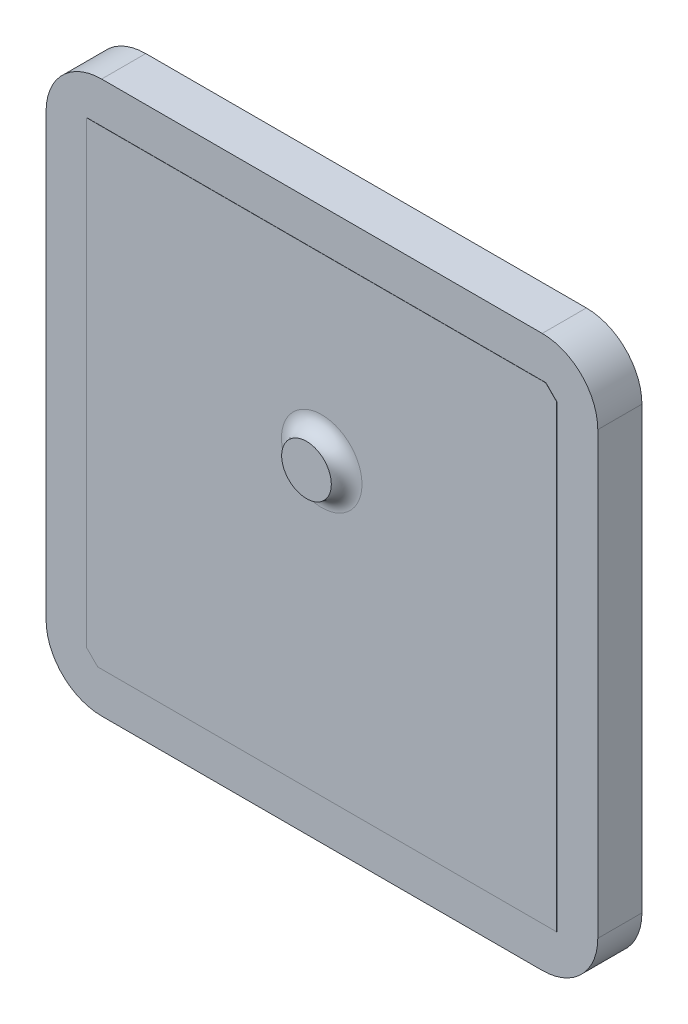
ISO-10303-21;
HEADER;
FILE_DESCRIPTION(('STEP AP214'),'2;1');
FILE_NAME('part.step','',(''),(''),'','','');
FILE_SCHEMA(('AUTOMOTIVE_DESIGN { 1 0 10303 214 1 1 1 1 }'));
ENDSEC;
DATA;
#1=APPLICATION_CONTEXT('core data for automotive mechanical design processes');
#2=APPLICATION_PROTOCOL_DEFINITION('international standard','automotive_design',2000,#1);
#3=PRODUCT_CONTEXT('',#1,'mechanical');
#4=PRODUCT('Part','Part','',(#3));
#5=PRODUCT_RELATED_PRODUCT_CATEGORY('part','',(#4));
#6=PRODUCT_DEFINITION_FORMATION('','',#4);
#7=PRODUCT_DEFINITION_CONTEXT('part definition',#1,'design');
#8=PRODUCT_DEFINITION('design','',#6,#7);
#9=PRODUCT_DEFINITION_SHAPE('','',#8);
#10=(LENGTH_UNIT() NAMED_UNIT(*) SI_UNIT(.MILLI.,.METRE.));
#11=(NAMED_UNIT(*) PLANE_ANGLE_UNIT() SI_UNIT($,.RADIAN.));
#12=(NAMED_UNIT(*) SI_UNIT($,.STERADIAN.) SOLID_ANGLE_UNIT());
#13=UNCERTAINTY_MEASURE_WITH_UNIT(LENGTH_MEASURE(1.E-05),#10,'distance_accuracy_value','');
#14=(GEOMETRIC_REPRESENTATION_CONTEXT(3) GLOBAL_UNCERTAINTY_ASSIGNED_CONTEXT((#13)) GLOBAL_UNIT_ASSIGNED_CONTEXT((#10,
#11,#12)) REPRESENTATION_CONTEXT('',''));
#15=CARTESIAN_POINT('',(0.,0.,0.));
#16=DIRECTION('',(0.,0.,1.));
#17=DIRECTION('',(1.,0.,0.));
#18=AXIS2_PLACEMENT_3D('',#15,#16,#17);
#19=CARTESIAN_POINT('',(-12.5,12.5,2.));
#20=DIRECTION('',(1.,0.,0.));
#21=DIRECTION('',(0.,1.,0.));
#22=AXIS2_PLACEMENT_3D('',#19,#20,#21);
#23=PLANE('',#22);
#24=DIRECTION('',(0.,-1.,0.));
#25=VECTOR('',#24,1.);
#26=CARTESIAN_POINT('',(-12.5,12.5,2.));
#27=LINE('',#26,#25);
#28=CARTESIAN_POINT('',(-12.5,9.98277308041276,2.));
#29=VERTEX_POINT('',#28);
#30=CARTESIAN_POINT('',(-12.5,-9.98277308041276,2.));
#31=VERTEX_POINT('',#30);
#32=EDGE_CURVE('E161',#29,#31,#27,.T.);
#33=ORIENTED_EDGE('',*,*,#32,.F.);
#34=DIRECTION('',(0.,0.,1.));
#35=VECTOR('',#34,1.);
#36=CARTESIAN_POINT('',(-12.5,9.98277308041276,0.));
#37=LINE('',#36,#35);
#38=CARTESIAN_POINT('',(-12.5,9.98277308041276,0.));
#39=VERTEX_POINT('',#38);
#40=EDGE_CURVE('E252',#39,#29,#37,.T.);
#41=ORIENTED_EDGE('',*,*,#40,.F.);
#42=DIRECTION('',(0.,-1.,0.));
#43=VECTOR('',#42,1.);
#44=CARTESIAN_POINT('',(-12.5,12.5,0.));
#45=LINE('',#44,#43);
#46=CARTESIAN_POINT('',(-12.5,-9.98277308041276,0.));
#47=VERTEX_POINT('',#46);
#48=EDGE_CURVE('E163',#39,#47,#45,.T.);
#49=ORIENTED_EDGE('',*,*,#48,.T.);
#50=DIRECTION('',(0.,0.,1.));
#51=VECTOR('',#50,1.);
#52=CARTESIAN_POINT('',(-12.5,-9.98277308041276,0.));
#53=LINE('',#52,#51);
#54=EDGE_CURVE('E251',#47,#31,#53,.T.);
#55=ORIENTED_EDGE('',*,*,#54,.T.);
#56=EDGE_LOOP('',(#33,#41,#49,#55));
#57=FACE_BOUND('',#56,.T.);
#58=ADVANCED_FACE('F35',(#57),#23,.F.);
#59=CARTESIAN_POINT('',(-12.5,-12.5,2.));
#60=DIRECTION('',(0.,1.,0.));
#61=DIRECTION('',(0.,0.,1.));
#62=AXIS2_PLACEMENT_3D('',#59,#60,#61);
#63=PLANE('',#62);
#64=DIRECTION('',(0.,0.,1.));
#65=VECTOR('',#64,1.);
#66=CARTESIAN_POINT('',(9.98277308041275,-12.5,0.));
#67=LINE('',#66,#65);
#68=CARTESIAN_POINT('',(9.98277308041275,-12.5,0.));
#69=VERTEX_POINT('',#68);
#70=CARTESIAN_POINT('',(9.98277308041275,-12.5,2.));
#71=VERTEX_POINT('',#70);
#72=EDGE_CURVE('E50',#69,#71,#67,.T.);
#73=ORIENTED_EDGE('',*,*,#72,.T.);
#74=DIRECTION('',(1.,0.,0.));
#75=VECTOR('',#74,1.);
#76=CARTESIAN_POINT('',(-12.5,-12.5,2.));
#77=LINE('',#76,#75);
#78=CARTESIAN_POINT('',(-9.98277308041275,-12.5,2.));
#79=VERTEX_POINT('',#78);
#80=EDGE_CURVE('E241',#79,#71,#77,.T.);
#81=ORIENTED_EDGE('',*,*,#80,.F.);
#82=DIRECTION('',(0.,0.,1.));
#83=VECTOR('',#82,1.);
#84=CARTESIAN_POINT('',(-9.98277308041275,-12.5,0.));
#85=LINE('',#84,#83);
#86=CARTESIAN_POINT('',(-9.98277308041275,-12.5,0.));
#87=VERTEX_POINT('',#86);
#88=EDGE_CURVE('E205',#87,#79,#85,.T.);
#89=ORIENTED_EDGE('',*,*,#88,.F.);
#90=DIRECTION('',(1.,0.,0.));
#91=VECTOR('',#90,1.);
#92=CARTESIAN_POINT('',(-12.5,-12.5,0.));
#93=LINE('',#92,#91);
#94=EDGE_CURVE('E158',#87,#69,#93,.T.);
#95=ORIENTED_EDGE('',*,*,#94,.T.);
#96=EDGE_LOOP('',(#73,#81,#89,#95));
#97=FACE_BOUND('',#96,.T.);
#98=ADVANCED_FACE('F271',(#97),#63,.F.);
#99=CARTESIAN_POINT('',(12.5,12.5,2.));
#100=DIRECTION('',(-1.,0.,0.));
#101=DIRECTION('',(0.,-1.,0.));
#102=AXIS2_PLACEMENT_3D('',#99,#100,#101);
#103=PLANE('',#102);
#104=DIRECTION('',(0.,0.,1.));
#105=VECTOR('',#104,1.);
#106=CARTESIAN_POINT('',(12.5,9.98277308041276,0.));
#107=LINE('',#106,#105);
#108=CARTESIAN_POINT('',(12.5,9.98277308041276,0.));
#109=VERTEX_POINT('',#108);
#110=CARTESIAN_POINT('',(12.5,9.98277308041276,2.));
#111=VERTEX_POINT('',#110);
#112=EDGE_CURVE('E58',#109,#111,#107,.T.);
#113=ORIENTED_EDGE('',*,*,#112,.T.);
#114=DIRECTION('',(0.,1.,0.));
#115=VECTOR('',#114,1.);
#116=CARTESIAN_POINT('',(12.5,12.5,2.));
#117=LINE('',#116,#115);
#118=CARTESIAN_POINT('',(12.5,-9.98277308041275,2.));
#119=VERTEX_POINT('',#118);
#120=EDGE_CURVE('E150',#119,#111,#117,.T.);
#121=ORIENTED_EDGE('',*,*,#120,.F.);
#122=DIRECTION('',(0.,0.,1.));
#123=VECTOR('',#122,1.);
#124=CARTESIAN_POINT('',(12.5,-9.98277308041275,0.));
#125=LINE('',#124,#123);
#126=CARTESIAN_POINT('',(12.5,-9.98277308041275,0.));
#127=VERTEX_POINT('',#126);
#128=EDGE_CURVE('E136',#127,#119,#125,.T.);
#129=ORIENTED_EDGE('',*,*,#128,.F.);
#130=DIRECTION('',(0.,1.,0.));
#131=VECTOR('',#130,1.);
#132=CARTESIAN_POINT('',(12.5,12.5,0.));
#133=LINE('',#132,#131);
#134=EDGE_CURVE('E148',#127,#109,#133,.T.);
#135=ORIENTED_EDGE('',*,*,#134,.T.);
#136=EDGE_LOOP('',(#113,#121,#129,#135));
#137=FACE_BOUND('',#136,.T.);
#138=ADVANCED_FACE('F147',(#137),#103,.F.);
#139=CARTESIAN_POINT('',(-12.5,12.5,2.));
#140=DIRECTION('',(0.,-1.,0.));
#141=DIRECTION('',(0.,0.,-1.));
#142=AXIS2_PLACEMENT_3D('',#139,#140,#141);
#143=PLANE('',#142);
#144=DIRECTION('',(0.,0.,1.));
#145=VECTOR('',#144,1.);
#146=CARTESIAN_POINT('',(-9.98277308041276,12.5,0.));
#147=LINE('',#146,#145);
#148=CARTESIAN_POINT('',(-9.98277308041276,12.5,0.));
#149=VERTEX_POINT('',#148);
#150=CARTESIAN_POINT('',(-9.98277308041276,12.5,2.));
#151=VERTEX_POINT('',#150);
#152=EDGE_CURVE('E262',#149,#151,#147,.T.);
#153=ORIENTED_EDGE('',*,*,#152,.T.);
#154=DIRECTION('',(-1.,0.,0.));
#155=VECTOR('',#154,1.);
#156=CARTESIAN_POINT('',(-12.5,12.5,2.));
#157=LINE('',#156,#155);
#158=CARTESIAN_POINT('',(9.98277308041275,12.5,2.));
#159=VERTEX_POINT('',#158);
#160=EDGE_CURVE('E171',#159,#151,#157,.T.);
#161=ORIENTED_EDGE('',*,*,#160,.F.);
#162=DIRECTION('',(0.,0.,1.));
#163=VECTOR('',#162,1.);
#164=CARTESIAN_POINT('',(9.98277308041275,12.5,0.));
#165=LINE('',#164,#163);
#166=CARTESIAN_POINT('',(9.98277308041275,12.5,0.));
#167=VERTEX_POINT('',#166);
#168=EDGE_CURVE('E278',#167,#159,#165,.T.);
#169=ORIENTED_EDGE('',*,*,#168,.F.);
#170=DIRECTION('',(-1.,0.,0.));
#171=VECTOR('',#170,1.);
#172=CARTESIAN_POINT('',(-12.5,12.5,0.));
#173=LINE('',#172,#171);
#174=EDGE_CURVE('E157',#167,#149,#173,.T.);
#175=ORIENTED_EDGE('',*,*,#174,.T.);
#176=EDGE_LOOP('',(#153,#161,#169,#175));
#177=FACE_BOUND('',#176,.T.);
#178=ADVANCED_FACE('F288',(#177),#143,.F.);
#179=CARTESIAN_POINT('',(0.,0.,2.));
#180=DIRECTION('',(0.,0.,1.));
#181=DIRECTION('',(1.,0.,0.));
#182=AXIS2_PLACEMENT_3D('',#179,#180,#181);
#183=PLANE('',#182);
#184=CARTESIAN_POINT('',(-9.98277308041276,9.98277308041276,2.));
#185=DIRECTION('',(0.,0.,-1.));
#186=DIRECTION('',(-1.,0.,0.));
#187=AXIS2_PLACEMENT_3D('',#184,#185,#186);
#188=CIRCLE('',#187,2.51722691958725);
#189=EDGE_CURVE('E282',#29,#151,#188,.T.);
#190=ORIENTED_EDGE('',*,*,#189,.F.);
#191=ORIENTED_EDGE('',*,*,#32,.T.);
#192=CARTESIAN_POINT('',(-9.98277308041275,-9.98277308041275,2.));
#193=DIRECTION('',(0.,0.,-1.));
#194=DIRECTION('',(-1.,0.,0.));
#195=AXIS2_PLACEMENT_3D('',#192,#193,#194);
#196=CIRCLE('',#195,2.51722691958725);
#197=EDGE_CURVE('E151',#79,#31,#196,.T.);
#198=ORIENTED_EDGE('',*,*,#197,.F.);
#199=ORIENTED_EDGE('',*,*,#80,.T.);
#200=CARTESIAN_POINT('',(9.98277308041276,-9.98277308041276,2.));
#201=DIRECTION('',(0.,0.,-1.));
#202=DIRECTION('',(1.,0.,0.));
#203=AXIS2_PLACEMENT_3D('',#200,#201,#202);
#204=CIRCLE('',#203,2.51722691958725);
#205=EDGE_CURVE('E142',#119,#71,#204,.T.);
#206=ORIENTED_EDGE('',*,*,#205,.F.);
#207=ORIENTED_EDGE('',*,*,#120,.T.);
#208=CARTESIAN_POINT('',(9.98277308041275,9.98277308041276,2.));
#209=DIRECTION('',(0.,0.,-1.));
#210=DIRECTION('',(-1.,0.,0.));
#211=AXIS2_PLACEMENT_3D('',#208,#209,#210);
#212=CIRCLE('',#211,2.51722691958725);
#213=EDGE_CURVE('E276',#159,#111,#212,.T.);
#214=ORIENTED_EDGE('',*,*,#213,.F.);
#215=ORIENTED_EDGE('',*,*,#160,.T.);
#216=EDGE_LOOP('',(#190,#191,#198,#199,#206,#207,#214,#215));
#217=FACE_BOUND('',#216,.T.);
#218=DIRECTION('',(1.,0.,0.));
#219=VECTOR('',#218,1.);
#220=CARTESIAN_POINT('',(-10.65,-10.65,2.));
#221=LINE('',#220,#219);
#222=CARTESIAN_POINT('',(-10.15,-10.65,2.));
#223=VERTEX_POINT('',#222);
#224=CARTESIAN_POINT('',(10.65,-10.65,2.));
#225=VERTEX_POINT('',#224);
#226=EDGE_CURVE('E194',#223,#225,#221,.T.);
#227=ORIENTED_EDGE('',*,*,#226,.F.);
#228=DIRECTION('',(0.707106781186543,-0.707106781186552,0.));
#229=VECTOR('',#228,1.);
#230=CARTESIAN_POINT('',(-10.15,-10.65,2.));
#231=LINE('',#230,#229);
#232=CARTESIAN_POINT('',(-10.65,-10.15,2.));
#233=VERTEX_POINT('',#232);
#234=EDGE_CURVE('E43',#223,#233,#231,.F.);
#235=ORIENTED_EDGE('',*,*,#234,.T.);
#236=DIRECTION('',(0.,-1.,0.));
#237=VECTOR('',#236,1.);
#238=CARTESIAN_POINT('',(-10.65,10.65,2.));
#239=LINE('',#238,#237);
#240=CARTESIAN_POINT('',(-10.65,10.65,2.));
#241=VERTEX_POINT('',#240);
#242=EDGE_CURVE('E192',#241,#233,#239,.T.);
#243=ORIENTED_EDGE('',*,*,#242,.F.);
#244=DIRECTION('',(-1.,0.,0.));
#245=VECTOR('',#244,1.);
#246=CARTESIAN_POINT('',(-10.65,10.65,2.));
#247=LINE('',#246,#245);
#248=CARTESIAN_POINT('',(10.15,10.65,2.));
#249=VERTEX_POINT('',#248);
#250=EDGE_CURVE('E224',#249,#241,#247,.T.);
#251=ORIENTED_EDGE('',*,*,#250,.F.);
#252=DIRECTION('',(-0.707106781186548,0.707106781186548,0.));
#253=VECTOR('',#252,1.);
#254=CARTESIAN_POINT('',(10.15,10.65,2.));
#255=LINE('',#254,#253);
#256=CARTESIAN_POINT('',(10.65,10.15,2.));
#257=VERTEX_POINT('',#256);
#258=EDGE_CURVE('E185',#249,#257,#255,.F.);
#259=ORIENTED_EDGE('',*,*,#258,.T.);
#260=DIRECTION('',(0.,1.,0.));
#261=VECTOR('',#260,1.);
#262=CARTESIAN_POINT('',(10.65,10.65,2.));
#263=LINE('',#262,#261);
#264=EDGE_CURVE('E230',#225,#257,#263,.T.);
#265=ORIENTED_EDGE('',*,*,#264,.F.);
#266=EDGE_LOOP('',(#227,#235,#243,#251,#259,#265));
#267=FACE_BOUND('',#266,.T.);
#268=ADVANCED_FACE('F190',(#217,#267),#183,.T.);
#269=CARTESIAN_POINT('',(0.,0.,0.));
#270=DIRECTION('',(0.,0.,1.));
#271=DIRECTION('',(1.,0.,0.));
#272=AXIS2_PLACEMENT_3D('',#269,#270,#271);
#273=PLANE('',#272);
#274=CARTESIAN_POINT('',(0.,2.5,0.));
#275=DIRECTION('',(0.,0.,1.));
#276=DIRECTION('',(1.,0.,0.));
#277=AXIS2_PLACEMENT_3D('',#274,#275,#276);
#278=CIRCLE('',#277,0.4);
#279=CARTESIAN_POINT('',(0.4,2.5,0.));
#280=VERTEX_POINT('',#279);
#281=EDGE_CURVE('E11',#280,#280,#278,.F.);
#282=ORIENTED_EDGE('',*,*,#281,.F.);
#283=EDGE_LOOP('',(#282));
#284=FACE_BOUND('',#283,.T.);
#285=ORIENTED_EDGE('',*,*,#48,.F.);
#286=CARTESIAN_POINT('',(-9.98277308041276,9.98277308041276,0.));
#287=DIRECTION('',(0.,0.,-1.));
#288=DIRECTION('',(-1.,0.,0.));
#289=AXIS2_PLACEMENT_3D('',#286,#287,#288);
#290=CIRCLE('',#289,2.51722691958725);
#291=EDGE_CURVE('E255',#39,#149,#290,.T.);
#292=ORIENTED_EDGE('',*,*,#291,.T.);
#293=ORIENTED_EDGE('',*,*,#174,.F.);
#294=CARTESIAN_POINT('',(9.98277308041275,9.98277308041276,0.));
#295=DIRECTION('',(0.,0.,-1.));
#296=DIRECTION('',(-1.,0.,0.));
#297=AXIS2_PLACEMENT_3D('',#294,#295,#296);
#298=CIRCLE('',#297,2.51722691958725);
#299=EDGE_CURVE('E156',#167,#109,#298,.T.);
#300=ORIENTED_EDGE('',*,*,#299,.T.);
#301=ORIENTED_EDGE('',*,*,#134,.F.);
#302=CARTESIAN_POINT('',(9.98277308041276,-9.98277308041276,0.));
#303=DIRECTION('',(0.,0.,-1.));
#304=DIRECTION('',(1.,0.,0.));
#305=AXIS2_PLACEMENT_3D('',#302,#303,#304);
#306=CIRCLE('',#305,2.51722691958725);
#307=EDGE_CURVE('E133',#127,#69,#306,.T.);
#308=ORIENTED_EDGE('',*,*,#307,.T.);
#309=ORIENTED_EDGE('',*,*,#94,.F.);
#310=CARTESIAN_POINT('',(-9.98277308041275,-9.98277308041275,0.));
#311=DIRECTION('',(0.,0.,-1.));
#312=DIRECTION('',(-1.,0.,0.));
#313=AXIS2_PLACEMENT_3D('',#310,#311,#312);
#314=CIRCLE('',#313,2.51722691958725);
#315=EDGE_CURVE('E256',#87,#47,#314,.T.);
#316=ORIENTED_EDGE('',*,*,#315,.T.);
#317=EDGE_LOOP('',(#285,#292,#293,#300,#301,#308,#309,#316));
#318=FACE_BOUND('',#317,.T.);
#319=ADVANCED_FACE('F154',(#284,#318),#273,.F.);
#320=CARTESIAN_POINT('',(-10.65,10.65,2.01));
#321=DIRECTION('',(1.,0.,0.));
#322=DIRECTION('',(0.,1.,0.));
#323=AXIS2_PLACEMENT_3D('',#320,#321,#322);
#324=PLANE('',#323);
#325=ORIENTED_EDGE('',*,*,#242,.T.);
#326=DIRECTION('',(0.,0.,1.));
#327=VECTOR('',#326,1.);
#328=CARTESIAN_POINT('',(-10.65,-10.15,2.01));
#329=LINE('',#328,#327);
#330=CARTESIAN_POINT('',(-10.65,-10.15,2.01));
#331=VERTEX_POINT('',#330);
#332=EDGE_CURVE('E183',#233,#331,#329,.T.);
#333=ORIENTED_EDGE('',*,*,#332,.T.);
#334=DIRECTION('',(0.,-1.,0.));
#335=VECTOR('',#334,1.);
#336=CARTESIAN_POINT('',(-10.65,10.65,2.01));
#337=LINE('',#336,#335);
#338=CARTESIAN_POINT('',(-10.65,10.65,2.01));
#339=VERTEX_POINT('',#338);
#340=EDGE_CURVE('E214',#339,#331,#337,.T.);
#341=ORIENTED_EDGE('',*,*,#340,.F.);
#342=DIRECTION('',(0.,0.,-1.));
#343=VECTOR('',#342,1.);
#344=CARTESIAN_POINT('',(-10.65,10.65,2.01));
#345=LINE('',#344,#343);
#346=EDGE_CURVE('E204',#339,#241,#345,.T.);
#347=ORIENTED_EDGE('',*,*,#346,.T.);
#348=EDGE_LOOP('',(#325,#333,#341,#347));
#349=FACE_BOUND('',#348,.T.);
#350=ADVANCED_FACE('F200',(#349),#324,.F.);
#351=CARTESIAN_POINT('',(-10.65,-10.65,2.01));
#352=DIRECTION('',(0.,1.,0.));
#353=DIRECTION('',(0.,0.,1.));
#354=AXIS2_PLACEMENT_3D('',#351,#352,#353);
#355=PLANE('',#354);
#356=DIRECTION('',(1.,0.,0.));
#357=VECTOR('',#356,1.);
#358=CARTESIAN_POINT('',(-10.65,-10.65,2.01));
#359=LINE('',#358,#357);
#360=CARTESIAN_POINT('',(-10.15,-10.65,2.01));
#361=VERTEX_POINT('',#360);
#362=CARTESIAN_POINT('',(10.65,-10.65,2.01));
#363=VERTEX_POINT('',#362);
#364=EDGE_CURVE('E212',#361,#363,#359,.T.);
#365=ORIENTED_EDGE('',*,*,#364,.F.);
#366=DIRECTION('',(0.,0.,-1.));
#367=VECTOR('',#366,1.);
#368=CARTESIAN_POINT('',(-10.15,-10.65,2.01));
#369=LINE('',#368,#367);
#370=EDGE_CURVE('E180',#361,#223,#369,.T.);
#371=ORIENTED_EDGE('',*,*,#370,.T.);
#372=ORIENTED_EDGE('',*,*,#226,.T.);
#373=DIRECTION('',(0.,0.,-1.));
#374=VECTOR('',#373,1.);
#375=CARTESIAN_POINT('',(10.65,-10.65,2.01));
#376=LINE('',#375,#374);
#377=EDGE_CURVE('E218',#363,#225,#376,.T.);
#378=ORIENTED_EDGE('',*,*,#377,.F.);
#379=EDGE_LOOP('',(#365,#371,#372,#378));
#380=FACE_BOUND('',#379,.T.);
#381=ADVANCED_FACE('F216',(#380),#355,.F.);
#382=CARTESIAN_POINT('',(10.65,10.65,2.01));
#383=DIRECTION('',(-1.,0.,0.));
#384=DIRECTION('',(0.,-1.,0.));
#385=AXIS2_PLACEMENT_3D('',#382,#383,#384);
#386=PLANE('',#385);
#387=ORIENTED_EDGE('',*,*,#264,.T.);
#388=DIRECTION('',(0.,0.,1.));
#389=VECTOR('',#388,1.);
#390=CARTESIAN_POINT('',(10.65,10.15,2.01));
#391=LINE('',#390,#389);
#392=CARTESIAN_POINT('',(10.65,10.15,2.01));
#393=VERTEX_POINT('',#392);
#394=EDGE_CURVE('E174',#257,#393,#391,.T.);
#395=ORIENTED_EDGE('',*,*,#394,.T.);
#396=DIRECTION('',(0.,1.,0.));
#397=VECTOR('',#396,1.);
#398=CARTESIAN_POINT('',(10.65,10.65,2.01));
#399=LINE('',#398,#397);
#400=EDGE_CURVE('E220',#363,#393,#399,.T.);
#401=ORIENTED_EDGE('',*,*,#400,.F.);
#402=ORIENTED_EDGE('',*,*,#377,.T.);
#403=EDGE_LOOP('',(#387,#395,#401,#402));
#404=FACE_BOUND('',#403,.T.);
#405=ADVANCED_FACE('F327',(#404),#386,.F.);
#406=CARTESIAN_POINT('',(-10.65,10.65,2.01));
#407=DIRECTION('',(0.,-1.,0.));
#408=DIRECTION('',(0.,0.,-1.));
#409=AXIS2_PLACEMENT_3D('',#406,#407,#408);
#410=PLANE('',#409);
#411=DIRECTION('',(-1.,0.,0.));
#412=VECTOR('',#411,1.);
#413=CARTESIAN_POINT('',(-10.65,10.65,2.01));
#414=LINE('',#413,#412);
#415=CARTESIAN_POINT('',(10.15,10.65,2.01));
#416=VERTEX_POINT('',#415);
#417=EDGE_CURVE('E222',#416,#339,#414,.T.);
#418=ORIENTED_EDGE('',*,*,#417,.F.);
#419=DIRECTION('',(0.,0.,-1.));
#420=VECTOR('',#419,1.);
#421=CARTESIAN_POINT('',(10.15,10.65,2.01));
#422=LINE('',#421,#420);
#423=EDGE_CURVE('E170',#416,#249,#422,.T.);
#424=ORIENTED_EDGE('',*,*,#423,.T.);
#425=ORIENTED_EDGE('',*,*,#250,.T.);
#426=ORIENTED_EDGE('',*,*,#346,.F.);
#427=EDGE_LOOP('',(#418,#424,#425,#426));
#428=FACE_BOUND('',#427,.T.);
#429=ADVANCED_FACE('F325',(#428),#410,.F.);
#430=CARTESIAN_POINT('',(0.,0.,2.01));
#431=DIRECTION('',(0.,0.,1.));
#432=DIRECTION('',(1.,0.,0.));
#433=AXIS2_PLACEMENT_3D('',#430,#431,#432);
#434=PLANE('',#433);
#435=CARTESIAN_POINT('',(0.,2.5,2.01));
#436=DIRECTION('',(0.,0.,1.));
#437=DIRECTION('',(1.,0.,0.));
#438=AXIS2_PLACEMENT_3D('',#435,#436,#437);
#439=CIRCLE('',#438,1.82492856778389);
#440=CARTESIAN_POINT('',(1.82492856778389,2.5,2.01));
#441=VERTEX_POINT('',#440);
#442=EDGE_CURVE('E167',#441,#441,#439,.F.);
#443=ORIENTED_EDGE('',*,*,#442,.T.);
#444=EDGE_LOOP('',(#443));
#445=FACE_BOUND('',#444,.T.);
#446=ORIENTED_EDGE('',*,*,#400,.T.);
#447=DIRECTION('',(0.707106781186548,-0.707106781186548,0.));
#448=VECTOR('',#447,1.);
#449=CARTESIAN_POINT('',(10.4,10.4,2.01));
#450=LINE('',#449,#448);
#451=EDGE_CURVE('E178',#393,#416,#450,.F.);
#452=ORIENTED_EDGE('',*,*,#451,.T.);
#453=ORIENTED_EDGE('',*,*,#417,.T.);
#454=ORIENTED_EDGE('',*,*,#340,.T.);
#455=DIRECTION('',(-0.707106781186543,0.707106781186552,0.));
#456=VECTOR('',#455,1.);
#457=CARTESIAN_POINT('',(-10.4000000000001,-10.3999999999999,2.01));
#458=LINE('',#457,#456);
#459=EDGE_CURVE('E176',#331,#361,#458,.F.);
#460=ORIENTED_EDGE('',*,*,#459,.T.);
#461=ORIENTED_EDGE('',*,*,#364,.T.);
#462=EDGE_LOOP('',(#446,#452,#453,#454,#460,#461));
#463=FACE_BOUND('',#462,.T.);
#464=ADVANCED_FACE('F211',(#445,#463),#434,.T.);
#465=CARTESIAN_POINT('',(0.,2.5,2.7));
#466=DIRECTION('',(0.,0.,1.));
#467=DIRECTION('',(1.,0.,0.));
#468=AXIS2_PLACEMENT_3D('',#465,#466,#467);
#469=PLANE('',#468);
#470=CARTESIAN_POINT('',(0.,2.5,2.7));
#471=DIRECTION('',(0.,0.,1.));
#472=DIRECTION('',(1.,0.,0.));
#473=AXIS2_PLACEMENT_3D('',#470,#471,#472);
#474=CIRCLE('',#473,1.125);
#475=CARTESIAN_POINT('',(1.125,2.5,2.7));
#476=VERTEX_POINT('',#475);
#477=EDGE_CURVE('E236',#476,#476,#474,.T.);
#478=ORIENTED_EDGE('',*,*,#477,.T.);
#479=EDGE_LOOP('',(#478));
#480=FACE_BOUND('',#479,.T.);
#481=ADVANCED_FACE('F313',(#480),#469,.T.);
#482=CARTESIAN_POINT('',(0.,2.5,2.71));
#483=DIRECTION('',(0.,0.,1.));
#484=DIRECTION('',(1.,0.,0.));
#485=AXIS2_PLACEMENT_3D('',#482,#483,#484);
#486=TOROIDAL_SURFACE('',#485,1.82492856778389,0.7);
#487=ORIENTED_EDGE('',*,*,#442,.F.);
#488=EDGE_LOOP('',(#487));
#489=FACE_BOUND('',#488,.T.);
#490=ORIENTED_EDGE('',*,*,#477,.F.);
#491=EDGE_LOOP('',(#490));
#492=FACE_BOUND('',#491,.T.);
#493=ADVANCED_FACE('F310',(#489,#492),#486,.F.);
#494=CARTESIAN_POINT('',(10.15,10.65,2.01));
#495=DIRECTION('',(-0.707106781186547,-0.707106781186547,0.));
#496=DIRECTION('',(0.,0.,-1.));
#497=AXIS2_PLACEMENT_3D('',#494,#495,#496);
#498=PLANE('',#497);
#499=ORIENTED_EDGE('',*,*,#451,.F.);
#500=ORIENTED_EDGE('',*,*,#394,.F.);
#501=ORIENTED_EDGE('',*,*,#258,.F.);
#502=ORIENTED_EDGE('',*,*,#423,.F.);
#503=EDGE_LOOP('',(#499,#500,#501,#502));
#504=FACE_BOUND('',#503,.T.);
#505=ADVANCED_FACE('F312',(#504),#498,.F.);
#506=CARTESIAN_POINT('',(-10.15,-10.65,2.01));
#507=DIRECTION('',(0.707106781186552,0.707106781186542,0.));
#508=DIRECTION('',(0.,0.,-1.));
#509=AXIS2_PLACEMENT_3D('',#506,#507,#508);
#510=PLANE('',#509);
#511=ORIENTED_EDGE('',*,*,#459,.F.);
#512=ORIENTED_EDGE('',*,*,#332,.F.);
#513=ORIENTED_EDGE('',*,*,#234,.F.);
#514=ORIENTED_EDGE('',*,*,#370,.F.);
#515=EDGE_LOOP('',(#511,#512,#513,#514));
#516=FACE_BOUND('',#515,.T.);
#517=ADVANCED_FACE('F37',(#516),#510,.F.);
#518=CARTESIAN_POINT('',(-9.98277308041275,-9.98277308041275,0.));
#519=DIRECTION('',(0.,0.,1.));
#520=DIRECTION('',(1.,0.,0.));
#521=AXIS2_PLACEMENT_3D('',#518,#519,#520);
#522=CYLINDRICAL_SURFACE('',#521,2.51722691958725);
#523=ORIENTED_EDGE('',*,*,#197,.T.);
#524=ORIENTED_EDGE('',*,*,#54,.F.);
#525=ORIENTED_EDGE('',*,*,#315,.F.);
#526=ORIENTED_EDGE('',*,*,#88,.T.);
#527=EDGE_LOOP('',(#523,#524,#525,#526));
#528=FACE_BOUND('',#527,.T.);
#529=ADVANCED_FACE('F266',(#528),#522,.T.);
#530=CARTESIAN_POINT('',(9.98277308041276,-9.98277308041276,0.));
#531=DIRECTION('',(0.,0.,1.));
#532=DIRECTION('',(1.,0.,0.));
#533=AXIS2_PLACEMENT_3D('',#530,#531,#532);
#534=CYLINDRICAL_SURFACE('',#533,2.51722691958725);
#535=ORIENTED_EDGE('',*,*,#205,.T.);
#536=ORIENTED_EDGE('',*,*,#72,.F.);
#537=ORIENTED_EDGE('',*,*,#307,.F.);
#538=ORIENTED_EDGE('',*,*,#128,.T.);
#539=EDGE_LOOP('',(#535,#536,#537,#538));
#540=FACE_BOUND('',#539,.T.);
#541=ADVANCED_FACE('F135',(#540),#534,.T.);
#542=CARTESIAN_POINT('',(9.98277308041275,9.98277308041276,0.));
#543=DIRECTION('',(0.,0.,1.));
#544=DIRECTION('',(1.,0.,0.));
#545=AXIS2_PLACEMENT_3D('',#542,#543,#544);
#546=CYLINDRICAL_SURFACE('',#545,2.51722691958725);
#547=ORIENTED_EDGE('',*,*,#213,.T.);
#548=ORIENTED_EDGE('',*,*,#112,.F.);
#549=ORIENTED_EDGE('',*,*,#299,.F.);
#550=ORIENTED_EDGE('',*,*,#168,.T.);
#551=EDGE_LOOP('',(#547,#548,#549,#550));
#552=FACE_BOUND('',#551,.T.);
#553=ADVANCED_FACE('F291',(#552),#546,.T.);
#554=CARTESIAN_POINT('',(-9.98277308041276,9.98277308041276,0.));
#555=DIRECTION('',(0.,0.,1.));
#556=DIRECTION('',(1.,0.,0.));
#557=AXIS2_PLACEMENT_3D('',#554,#555,#556);
#558=CYLINDRICAL_SURFACE('',#557,2.51722691958725);
#559=ORIENTED_EDGE('',*,*,#189,.T.);
#560=ORIENTED_EDGE('',*,*,#152,.F.);
#561=ORIENTED_EDGE('',*,*,#291,.F.);
#562=ORIENTED_EDGE('',*,*,#40,.T.);
#563=EDGE_LOOP('',(#559,#560,#561,#562));
#564=FACE_BOUND('',#563,.T.);
#565=ADVANCED_FACE('F293',(#564),#558,.T.);
#566=CARTESIAN_POINT('',(0.,2.5,-2.));
#567=DIRECTION('',(0.,0.,1.));
#568=DIRECTION('',(1.,0.,0.));
#569=AXIS2_PLACEMENT_3D('',#566,#567,#568);
#570=CYLINDRICAL_SURFACE('',#569,0.4);
#571=CARTESIAN_POINT('',(0.,2.5,-2.));
#572=DIRECTION('',(0.,0.,-1.));
#573=DIRECTION('',(-1.,0.,0.));
#574=AXIS2_PLACEMENT_3D('',#571,#572,#573);
#575=CIRCLE('',#574,0.4);
#576=CARTESIAN_POINT('',(-0.4,2.5,-2.));
#577=VERTEX_POINT('',#576);
#578=EDGE_CURVE('E283',#577,#577,#575,.T.);
#579=ORIENTED_EDGE('',*,*,#578,.F.);
#580=EDGE_LOOP('',(#579));
#581=FACE_BOUND('',#580,.T.);
#582=ORIENTED_EDGE('',*,*,#281,.T.);
#583=EDGE_LOOP('',(#582));
#584=FACE_BOUND('',#583,.T.);
#585=ADVANCED_FACE('F299',(#581,#584),#570,.T.);
#586=CARTESIAN_POINT('',(0.,2.5,-2.));
#587=DIRECTION('',(0.,0.,-1.));
#588=DIRECTION('',(-1.,0.,0.));
#589=AXIS2_PLACEMENT_3D('',#586,#587,#588);
#590=PLANE('',#589);
#591=ORIENTED_EDGE('',*,*,#578,.T.);
#592=EDGE_LOOP('',(#591));
#593=FACE_BOUND('',#592,.T.);
#594=ADVANCED_FACE('F447',(#593),#590,.T.);
#595=CLOSED_SHELL('',(#58,#98,#138,#178,#268,#319,#350,#381,#405,#429,#464,#481,#493,#505,#517,
#529,#541,#553,#565,#585,#594));
#596=MANIFOLD_SOLID_BREP('B2',#595);
#597=ADVANCED_BREP_SHAPE_REPRESENTATION('',(#18,#596),#14);
#598=SHAPE_DEFINITION_REPRESENTATION(#9,#597);
ENDSEC;
END-ISO-10303-21;
